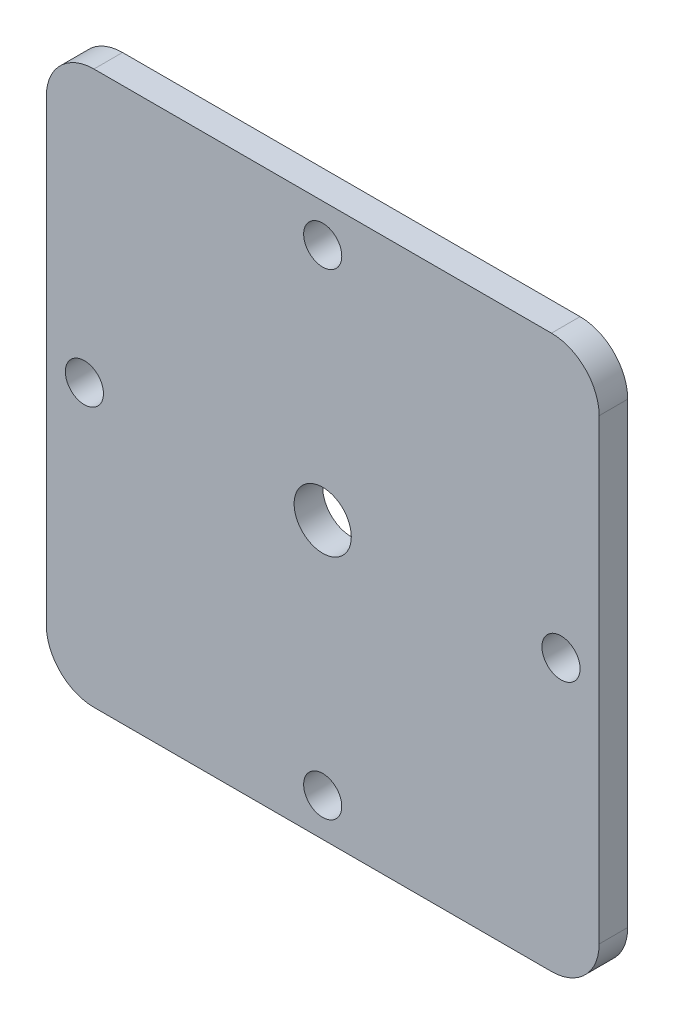
ISO-10303-21;
HEADER;
FILE_DESCRIPTION(('STEP AP214'),'2;1');
FILE_NAME('part.step','',(''),(''),'','','');
FILE_SCHEMA(('AUTOMOTIVE_DESIGN { 1 0 10303 214 1 1 1 1 }'));
ENDSEC;
DATA;
#1=APPLICATION_CONTEXT('core data for automotive mechanical design processes');
#2=APPLICATION_PROTOCOL_DEFINITION('international standard','automotive_design',2000,#1);
#3=PRODUCT_CONTEXT('',#1,'mechanical');
#4=PRODUCT('Part','Part','',(#3));
#5=PRODUCT_RELATED_PRODUCT_CATEGORY('part','',(#4));
#6=PRODUCT_DEFINITION_FORMATION('','',#4);
#7=PRODUCT_DEFINITION_CONTEXT('part definition',#1,'design');
#8=PRODUCT_DEFINITION('design','',#6,#7);
#9=PRODUCT_DEFINITION_SHAPE('','',#8);
#10=(LENGTH_UNIT() NAMED_UNIT(*) SI_UNIT(.MILLI.,.METRE.));
#11=(NAMED_UNIT(*) PLANE_ANGLE_UNIT() SI_UNIT($,.RADIAN.));
#12=(NAMED_UNIT(*) SI_UNIT($,.STERADIAN.) SOLID_ANGLE_UNIT());
#13=UNCERTAINTY_MEASURE_WITH_UNIT(LENGTH_MEASURE(1.E-05),#10,'distance_accuracy_value','');
#14=(GEOMETRIC_REPRESENTATION_CONTEXT(3) GLOBAL_UNCERTAINTY_ASSIGNED_CONTEXT((#13)) GLOBAL_UNIT_ASSIGNED_CONTEXT((#10,
#11,#12)) REPRESENTATION_CONTEXT('',''));
#15=CARTESIAN_POINT('',(0.,0.,0.));
#16=DIRECTION('',(0.,0.,1.));
#17=DIRECTION('',(1.,0.,0.));
#18=AXIS2_PLACEMENT_3D('',#15,#16,#17);
#19=CARTESIAN_POINT('',(24.,24.,3.));
#20=DIRECTION('',(0.,0.,1.));
#21=DIRECTION('',(1.,0.,0.));
#22=AXIS2_PLACEMENT_3D('',#19,#20,#21);
#23=CYLINDRICAL_SURFACE('',#22,5.);
#24=DIRECTION('',(0.,0.,1.));
#25=VECTOR('',#24,1.);
#26=CARTESIAN_POINT('',(29.,24.,3.));
#27=LINE('',#26,#25);
#28=CARTESIAN_POINT('',(29.,24.,0.));
#29=VERTEX_POINT('',#28);
#30=CARTESIAN_POINT('',(29.,24.,3.));
#31=VERTEX_POINT('',#30);
#32=EDGE_CURVE('E161',#29,#31,#27,.T.);
#33=ORIENTED_EDGE('',*,*,#32,.F.);
#34=CARTESIAN_POINT('',(24.,24.,0.));
#35=DIRECTION('',(0.,0.,-1.));
#36=DIRECTION('',(-1.,0.,0.));
#37=AXIS2_PLACEMENT_3D('',#34,#35,#36);
#38=CIRCLE('',#37,5.);
#39=CARTESIAN_POINT('',(24.,29.,0.));
#40=VERTEX_POINT('',#39);
#41=EDGE_CURVE('E44',#40,#29,#38,.T.);
#42=ORIENTED_EDGE('',*,*,#41,.F.);
#43=DIRECTION('',(0.,0.,1.));
#44=VECTOR('',#43,1.);
#45=CARTESIAN_POINT('',(24.,29.,3.));
#46=LINE('',#45,#44);
#47=CARTESIAN_POINT('',(24.,29.,3.));
#48=VERTEX_POINT('',#47);
#49=EDGE_CURVE('E163',#48,#40,#46,.F.);
#50=ORIENTED_EDGE('',*,*,#49,.F.);
#51=CARTESIAN_POINT('',(24.,24.,3.));
#52=DIRECTION('',(0.,0.,-1.));
#53=DIRECTION('',(-1.,0.,0.));
#54=AXIS2_PLACEMENT_3D('',#51,#52,#53);
#55=CIRCLE('',#54,5.);
#56=EDGE_CURVE('E11',#31,#48,#55,.F.);
#57=ORIENTED_EDGE('',*,*,#56,.F.);
#58=EDGE_LOOP('',(#33,#42,#50,#57));
#59=FACE_BOUND('',#58,.T.);
#60=ADVANCED_FACE('F37',(#59),#23,.T.);
#61=CARTESIAN_POINT('',(-24.,24.,3.));
#62=DIRECTION('',(0.,0.,1.));
#63=DIRECTION('',(1.,0.,0.));
#64=AXIS2_PLACEMENT_3D('',#61,#62,#63);
#65=CYLINDRICAL_SURFACE('',#64,5.);
#66=DIRECTION('',(0.,0.,1.));
#67=VECTOR('',#66,1.);
#68=CARTESIAN_POINT('',(-24.,29.,3.));
#69=LINE('',#68,#67);
#70=CARTESIAN_POINT('',(-24.,29.,0.));
#71=VERTEX_POINT('',#70);
#72=CARTESIAN_POINT('',(-24.,29.,3.));
#73=VERTEX_POINT('',#72);
#74=EDGE_CURVE('E150',#71,#73,#69,.T.);
#75=ORIENTED_EDGE('',*,*,#74,.F.);
#76=CARTESIAN_POINT('',(-24.,24.,0.));
#77=DIRECTION('',(0.,0.,-1.));
#78=DIRECTION('',(-1.,0.,0.));
#79=AXIS2_PLACEMENT_3D('',#76,#77,#78);
#80=CIRCLE('',#79,5.);
#81=CARTESIAN_POINT('',(-29.,24.,0.));
#82=VERTEX_POINT('',#81);
#83=EDGE_CURVE('E156',#82,#71,#80,.T.);
#84=ORIENTED_EDGE('',*,*,#83,.F.);
#85=DIRECTION('',(0.,0.,1.));
#86=VECTOR('',#85,1.);
#87=CARTESIAN_POINT('',(-29.,24.,3.));
#88=LINE('',#87,#86);
#89=CARTESIAN_POINT('',(-29.,24.,3.));
#90=VERTEX_POINT('',#89);
#91=EDGE_CURVE('E153',#90,#82,#88,.F.);
#92=ORIENTED_EDGE('',*,*,#91,.F.);
#93=CARTESIAN_POINT('',(-24.,24.,3.));
#94=DIRECTION('',(0.,0.,-1.));
#95=DIRECTION('',(-1.,0.,0.));
#96=AXIS2_PLACEMENT_3D('',#93,#94,#95);
#97=CIRCLE('',#96,5.);
#98=EDGE_CURVE('E159',#73,#90,#97,.F.);
#99=ORIENTED_EDGE('',*,*,#98,.F.);
#100=EDGE_LOOP('',(#75,#84,#92,#99));
#101=FACE_BOUND('',#100,.T.);
#102=ADVANCED_FACE('F173',(#101),#65,.T.);
#103=CARTESIAN_POINT('',(-24.,-24.,3.));
#104=DIRECTION('',(0.,0.,-1.));
#105=DIRECTION('',(-1.,0.,0.));
#106=AXIS2_PLACEMENT_3D('',#103,#104,#105);
#107=CYLINDRICAL_SURFACE('',#106,5.);
#108=DIRECTION('',(0.,0.,-1.));
#109=VECTOR('',#108,1.);
#110=CARTESIAN_POINT('',(-24.,-29.,3.));
#111=LINE('',#110,#109);
#112=CARTESIAN_POINT('',(-24.,-29.,3.));
#113=VERTEX_POINT('',#112);
#114=CARTESIAN_POINT('',(-24.,-29.,0.));
#115=VERTEX_POINT('',#114);
#116=EDGE_CURVE('E110',#113,#115,#111,.T.);
#117=ORIENTED_EDGE('',*,*,#116,.F.);
#118=CARTESIAN_POINT('',(-24.,-24.,3.));
#119=DIRECTION('',(0.,0.,-1.));
#120=DIRECTION('',(-1.,0.,0.));
#121=AXIS2_PLACEMENT_3D('',#118,#119,#120);
#122=CIRCLE('',#121,5.);
#123=CARTESIAN_POINT('',(-29.,-24.,3.));
#124=VERTEX_POINT('',#123);
#125=EDGE_CURVE('E145',#124,#113,#122,.F.);
#126=ORIENTED_EDGE('',*,*,#125,.F.);
#127=DIRECTION('',(0.,0.,-1.));
#128=VECTOR('',#127,1.);
#129=CARTESIAN_POINT('',(-29.,-24.,3.));
#130=LINE('',#129,#128);
#131=CARTESIAN_POINT('',(-29.,-24.,0.));
#132=VERTEX_POINT('',#131);
#133=EDGE_CURVE('E142',#132,#124,#130,.F.);
#134=ORIENTED_EDGE('',*,*,#133,.F.);
#135=CARTESIAN_POINT('',(-24.,-24.,0.));
#136=DIRECTION('',(0.,0.,-1.));
#137=DIRECTION('',(-1.,0.,0.));
#138=AXIS2_PLACEMENT_3D('',#135,#136,#137);
#139=CIRCLE('',#138,5.);
#140=EDGE_CURVE('E147',#115,#132,#139,.T.);
#141=ORIENTED_EDGE('',*,*,#140,.F.);
#142=EDGE_LOOP('',(#117,#126,#134,#141));
#143=FACE_BOUND('',#142,.T.);
#144=ADVANCED_FACE('F225',(#143),#107,.T.);
#145=CARTESIAN_POINT('',(24.,-24.,3.));
#146=DIRECTION('',(0.,0.,-1.));
#147=DIRECTION('',(-1.,0.,0.));
#148=AXIS2_PLACEMENT_3D('',#145,#146,#147);
#149=CYLINDRICAL_SURFACE('',#148,5.);
#150=DIRECTION('',(0.,0.,-1.));
#151=VECTOR('',#150,1.);
#152=CARTESIAN_POINT('',(29.,-24.,3.));
#153=LINE('',#152,#151);
#154=CARTESIAN_POINT('',(29.,-24.,3.));
#155=VERTEX_POINT('',#154);
#156=CARTESIAN_POINT('',(29.,-24.,0.));
#157=VERTEX_POINT('',#156);
#158=EDGE_CURVE('E103',#155,#157,#153,.T.);
#159=ORIENTED_EDGE('',*,*,#158,.F.);
#160=CARTESIAN_POINT('',(24.,-24.,3.));
#161=DIRECTION('',(0.,0.,-1.));
#162=DIRECTION('',(-1.,0.,0.));
#163=AXIS2_PLACEMENT_3D('',#160,#161,#162);
#164=CIRCLE('',#163,5.);
#165=CARTESIAN_POINT('',(24.,-29.,3.));
#166=VERTEX_POINT('',#165);
#167=EDGE_CURVE('E111',#166,#155,#164,.F.);
#168=ORIENTED_EDGE('',*,*,#167,.F.);
#169=DIRECTION('',(0.,0.,-1.));
#170=VECTOR('',#169,1.);
#171=CARTESIAN_POINT('',(24.,-29.,3.));
#172=LINE('',#171,#170);
#173=CARTESIAN_POINT('',(24.,-29.,0.));
#174=VERTEX_POINT('',#173);
#175=EDGE_CURVE('E106',#174,#166,#172,.F.);
#176=ORIENTED_EDGE('',*,*,#175,.F.);
#177=CARTESIAN_POINT('',(24.,-24.,0.));
#178=DIRECTION('',(0.,0.,-1.));
#179=DIRECTION('',(-1.,0.,0.));
#180=AXIS2_PLACEMENT_3D('',#177,#178,#179);
#181=CIRCLE('',#180,5.);
#182=EDGE_CURVE('E99',#157,#174,#181,.T.);
#183=ORIENTED_EDGE('',*,*,#182,.F.);
#184=EDGE_LOOP('',(#159,#168,#176,#183));
#185=FACE_BOUND('',#184,.T.);
#186=ADVANCED_FACE('F101',(#185),#149,.T.);
#187=CARTESIAN_POINT('',(0.,0.,3.));
#188=DIRECTION('',(0.,0.,-1.));
#189=DIRECTION('',(-1.,0.,0.));
#190=AXIS2_PLACEMENT_3D('',#187,#188,#189);
#191=PLANE('',#190);
#192=CARTESIAN_POINT('',(0.,0.,3.));
#193=DIRECTION('',(0.,0.,1.));
#194=DIRECTION('',(1.,0.,0.));
#195=AXIS2_PLACEMENT_3D('',#192,#193,#194);
#196=CIRCLE('',#195,3.);
#197=CARTESIAN_POINT('',(3.,0.,3.));
#198=VERTEX_POINT('',#197);
#199=EDGE_CURVE('E203',#198,#198,#196,.T.);
#200=ORIENTED_EDGE('',*,*,#199,.F.);
#201=EDGE_LOOP('',(#200));
#202=FACE_BOUND('',#201,.T.);
#203=DIRECTION('',(0.,1.,0.));
#204=VECTOR('',#203,1.);
#205=CARTESIAN_POINT('',(29.,-29.,3.));
#206=LINE('',#205,#204);
#207=EDGE_CURVE('E118',#155,#31,#206,.T.);
#208=ORIENTED_EDGE('',*,*,#207,.T.);
#209=ORIENTED_EDGE('',*,*,#56,.T.);
#210=DIRECTION('',(-1.,0.,0.));
#211=VECTOR('',#210,1.);
#212=CARTESIAN_POINT('',(-29.,29.,3.));
#213=LINE('',#212,#211);
#214=EDGE_CURVE('E167',#48,#73,#213,.T.);
#215=ORIENTED_EDGE('',*,*,#214,.T.);
#216=ORIENTED_EDGE('',*,*,#98,.T.);
#217=DIRECTION('',(0.,-1.,0.));
#218=VECTOR('',#217,1.);
#219=CARTESIAN_POINT('',(-29.,-29.,3.));
#220=LINE('',#219,#218);
#221=EDGE_CURVE('E177',#90,#124,#220,.T.);
#222=ORIENTED_EDGE('',*,*,#221,.T.);
#223=ORIENTED_EDGE('',*,*,#125,.T.);
#224=DIRECTION('',(1.,0.,0.));
#225=VECTOR('',#224,1.);
#226=CARTESIAN_POINT('',(-29.,-29.,3.));
#227=LINE('',#226,#225);
#228=EDGE_CURVE('E119',#113,#166,#227,.T.);
#229=ORIENTED_EDGE('',*,*,#228,.T.);
#230=ORIENTED_EDGE('',*,*,#167,.T.);
#231=EDGE_LOOP('',(#208,#209,#215,#216,#222,#223,#229,#230));
#232=FACE_BOUND('',#231,.T.);
#233=CARTESIAN_POINT('',(0.,25.,3.));
#234=DIRECTION('',(0.,0.,1.));
#235=DIRECTION('',(1.,0.,0.));
#236=AXIS2_PLACEMENT_3D('',#233,#234,#235);
#237=CIRCLE('',#236,2.);
#238=CARTESIAN_POINT('',(1.99999999999999,25.,3.));
#239=VERTEX_POINT('',#238);
#240=EDGE_CURVE('E125',#239,#239,#237,.T.);
#241=ORIENTED_EDGE('',*,*,#240,.F.);
#242=EDGE_LOOP('',(#241));
#243=FACE_BOUND('',#242,.T.);
#244=CARTESIAN_POINT('',(-25.,0.,3.));
#245=DIRECTION('',(0.,0.,1.));
#246=DIRECTION('',(-1.,0.,0.));
#247=AXIS2_PLACEMENT_3D('',#244,#245,#246);
#248=CIRCLE('',#247,2.);
#249=CARTESIAN_POINT('',(-27.,0.,3.));
#250=VERTEX_POINT('',#249);
#251=EDGE_CURVE('E183',#250,#250,#248,.T.);
#252=ORIENTED_EDGE('',*,*,#251,.F.);
#253=EDGE_LOOP('',(#252));
#254=FACE_BOUND('',#253,.T.);
#255=CARTESIAN_POINT('',(0.,-25.,3.));
#256=DIRECTION('',(0.,0.,1.));
#257=DIRECTION('',(-1.,0.,0.));
#258=AXIS2_PLACEMENT_3D('',#255,#256,#257);
#259=CIRCLE('',#258,2.);
#260=CARTESIAN_POINT('',(-2.00000000000001,-25.,3.));
#261=VERTEX_POINT('',#260);
#262=EDGE_CURVE('E188',#261,#261,#259,.T.);
#263=ORIENTED_EDGE('',*,*,#262,.F.);
#264=EDGE_LOOP('',(#263));
#265=FACE_BOUND('',#264,.T.);
#266=CARTESIAN_POINT('',(25.,0.,3.));
#267=DIRECTION('',(0.,0.,1.));
#268=DIRECTION('',(-1.,0.,0.));
#269=AXIS2_PLACEMENT_3D('',#266,#267,#268);
#270=CIRCLE('',#269,2.);
#271=CARTESIAN_POINT('',(23.,0.,3.));
#272=VERTEX_POINT('',#271);
#273=EDGE_CURVE('E194',#272,#272,#270,.T.);
#274=ORIENTED_EDGE('',*,*,#273,.F.);
#275=EDGE_LOOP('',(#274));
#276=FACE_BOUND('',#275,.T.);
#277=ADVANCED_FACE('F175',(#202,#232,#243,#254,#265,#276),#191,.F.);
#278=CARTESIAN_POINT('',(0.,0.,0.));
#279=DIRECTION('',(0.,0.,-1.));
#280=DIRECTION('',(-1.,0.,0.));
#281=AXIS2_PLACEMENT_3D('',#278,#279,#280);
#282=PLANE('',#281);
#283=CARTESIAN_POINT('',(0.,0.,0.));
#284=DIRECTION('',(0.,0.,1.));
#285=DIRECTION('',(1.,0.,0.));
#286=AXIS2_PLACEMENT_3D('',#283,#284,#285);
#287=CIRCLE('',#286,3.);
#288=CARTESIAN_POINT('',(3.,0.,0.));
#289=VERTEX_POINT('',#288);
#290=EDGE_CURVE('E200',#289,#289,#287,.T.);
#291=ORIENTED_EDGE('',*,*,#290,.T.);
#292=EDGE_LOOP('',(#291));
#293=FACE_BOUND('',#292,.T.);
#294=CARTESIAN_POINT('',(0.,-25.,0.));
#295=DIRECTION('',(0.,0.,1.));
#296=DIRECTION('',(-1.,0.,0.));
#297=AXIS2_PLACEMENT_3D('',#294,#295,#296);
#298=CIRCLE('',#297,2.);
#299=CARTESIAN_POINT('',(-2.00000000000001,-25.,0.));
#300=VERTEX_POINT('',#299);
#301=EDGE_CURVE('E191',#300,#300,#298,.T.);
#302=ORIENTED_EDGE('',*,*,#301,.T.);
#303=EDGE_LOOP('',(#302));
#304=FACE_BOUND('',#303,.T.);
#305=CARTESIAN_POINT('',(0.,25.,0.));
#306=DIRECTION('',(0.,0.,1.));
#307=DIRECTION('',(1.,0.,0.));
#308=AXIS2_PLACEMENT_3D('',#305,#306,#307);
#309=CIRCLE('',#308,2.);
#310=CARTESIAN_POINT('',(1.99999999999999,25.,0.));
#311=VERTEX_POINT('',#310);
#312=EDGE_CURVE('E130',#311,#311,#309,.T.);
#313=ORIENTED_EDGE('',*,*,#312,.T.);
#314=EDGE_LOOP('',(#313));
#315=FACE_BOUND('',#314,.T.);
#316=DIRECTION('',(-1.,0.,0.));
#317=VECTOR('',#316,1.);
#318=CARTESIAN_POINT('',(-29.,29.,0.));
#319=LINE('',#318,#317);
#320=EDGE_CURVE('E124',#40,#71,#319,.T.);
#321=ORIENTED_EDGE('',*,*,#320,.F.);
#322=ORIENTED_EDGE('',*,*,#41,.T.);
#323=DIRECTION('',(0.,1.,0.));
#324=VECTOR('',#323,1.);
#325=CARTESIAN_POINT('',(29.,-29.,0.));
#326=LINE('',#325,#324);
#327=EDGE_CURVE('E117',#157,#29,#326,.T.);
#328=ORIENTED_EDGE('',*,*,#327,.F.);
#329=ORIENTED_EDGE('',*,*,#182,.T.);
#330=DIRECTION('',(1.,0.,0.));
#331=VECTOR('',#330,1.);
#332=CARTESIAN_POINT('',(-29.,-29.,0.));
#333=LINE('',#332,#331);
#334=EDGE_CURVE('E136',#115,#174,#333,.T.);
#335=ORIENTED_EDGE('',*,*,#334,.F.);
#336=ORIENTED_EDGE('',*,*,#140,.T.);
#337=DIRECTION('',(0.,-1.,0.));
#338=VECTOR('',#337,1.);
#339=CARTESIAN_POINT('',(-29.,-29.,0.));
#340=LINE('',#339,#338);
#341=EDGE_CURVE('E127',#82,#132,#340,.T.);
#342=ORIENTED_EDGE('',*,*,#341,.F.);
#343=ORIENTED_EDGE('',*,*,#83,.T.);
#344=EDGE_LOOP('',(#321,#322,#328,#329,#335,#336,#342,#343));
#345=FACE_BOUND('',#344,.T.);
#346=CARTESIAN_POINT('',(-25.,0.,0.));
#347=DIRECTION('',(0.,0.,1.));
#348=DIRECTION('',(-1.,0.,0.));
#349=AXIS2_PLACEMENT_3D('',#346,#347,#348);
#350=CIRCLE('',#349,2.);
#351=CARTESIAN_POINT('',(-27.,0.,0.));
#352=VERTEX_POINT('',#351);
#353=EDGE_CURVE('E185',#352,#352,#350,.T.);
#354=ORIENTED_EDGE('',*,*,#353,.T.);
#355=EDGE_LOOP('',(#354));
#356=FACE_BOUND('',#355,.T.);
#357=CARTESIAN_POINT('',(25.,0.,0.));
#358=DIRECTION('',(0.,0.,1.));
#359=DIRECTION('',(-1.,0.,0.));
#360=AXIS2_PLACEMENT_3D('',#357,#358,#359);
#361=CIRCLE('',#360,2.);
#362=CARTESIAN_POINT('',(23.,0.,0.));
#363=VERTEX_POINT('',#362);
#364=EDGE_CURVE('E197',#363,#363,#361,.T.);
#365=ORIENTED_EDGE('',*,*,#364,.T.);
#366=EDGE_LOOP('',(#365));
#367=FACE_BOUND('',#366,.T.);
#368=ADVANCED_FACE('F122',(#293,#304,#315,#345,#356,#367),#282,.T.);
#369=CARTESIAN_POINT('',(29.,-29.,3.));
#370=DIRECTION('',(-1.,0.,0.));
#371=DIRECTION('',(0.,0.,1.));
#372=AXIS2_PLACEMENT_3D('',#369,#370,#371);
#373=PLANE('',#372);
#374=ORIENTED_EDGE('',*,*,#327,.T.);
#375=ORIENTED_EDGE('',*,*,#32,.T.);
#376=ORIENTED_EDGE('',*,*,#207,.F.);
#377=ORIENTED_EDGE('',*,*,#158,.T.);
#378=EDGE_LOOP('',(#374,#375,#376,#377));
#379=FACE_BOUND('',#378,.T.);
#380=ADVANCED_FACE('F115',(#379),#373,.F.);
#381=CARTESIAN_POINT('',(-29.,29.,3.));
#382=DIRECTION('',(0.,-1.,0.));
#383=DIRECTION('',(0.,0.,-1.));
#384=AXIS2_PLACEMENT_3D('',#381,#382,#383);
#385=PLANE('',#384);
#386=ORIENTED_EDGE('',*,*,#214,.F.);
#387=ORIENTED_EDGE('',*,*,#49,.T.);
#388=ORIENTED_EDGE('',*,*,#320,.T.);
#389=ORIENTED_EDGE('',*,*,#74,.T.);
#390=EDGE_LOOP('',(#386,#387,#388,#389));
#391=FACE_BOUND('',#390,.T.);
#392=ADVANCED_FACE('F166',(#391),#385,.F.);
#393=CARTESIAN_POINT('',(-29.,-29.,3.));
#394=DIRECTION('',(1.,0.,0.));
#395=DIRECTION('',(0.,0.,-1.));
#396=AXIS2_PLACEMENT_3D('',#393,#394,#395);
#397=PLANE('',#396);
#398=ORIENTED_EDGE('',*,*,#221,.F.);
#399=ORIENTED_EDGE('',*,*,#91,.T.);
#400=ORIENTED_EDGE('',*,*,#341,.T.);
#401=ORIENTED_EDGE('',*,*,#133,.T.);
#402=EDGE_LOOP('',(#398,#399,#400,#401));
#403=FACE_BOUND('',#402,.T.);
#404=ADVANCED_FACE('F239',(#403),#397,.F.);
#405=CARTESIAN_POINT('',(-29.,-29.,3.));
#406=DIRECTION('',(0.,1.,0.));
#407=DIRECTION('',(0.,0.,1.));
#408=AXIS2_PLACEMENT_3D('',#405,#406,#407);
#409=PLANE('',#408);
#410=ORIENTED_EDGE('',*,*,#228,.F.);
#411=ORIENTED_EDGE('',*,*,#116,.T.);
#412=ORIENTED_EDGE('',*,*,#334,.T.);
#413=ORIENTED_EDGE('',*,*,#175,.T.);
#414=EDGE_LOOP('',(#410,#411,#412,#413));
#415=FACE_BOUND('',#414,.T.);
#416=ADVANCED_FACE('F234',(#415),#409,.F.);
#417=CARTESIAN_POINT('',(0.,25.,3.));
#418=DIRECTION('',(0.,0.,-1.));
#419=DIRECTION('',(-1.,0.,0.));
#420=AXIS2_PLACEMENT_3D('',#417,#418,#419);
#421=CYLINDRICAL_SURFACE('',#420,2.);
#422=ORIENTED_EDGE('',*,*,#240,.T.);
#423=EDGE_LOOP('',(#422));
#424=FACE_BOUND('',#423,.T.);
#425=ORIENTED_EDGE('',*,*,#312,.F.);
#426=EDGE_LOOP('',(#425));
#427=FACE_BOUND('',#426,.T.);
#428=ADVANCED_FACE('F246',(#424,#427),#421,.F.);
#429=CARTESIAN_POINT('',(-25.,0.,3.));
#430=DIRECTION('',(0.,0.,-1.));
#431=DIRECTION('',(-1.,0.,0.));
#432=AXIS2_PLACEMENT_3D('',#429,#430,#431);
#433=CYLINDRICAL_SURFACE('',#432,2.);
#434=ORIENTED_EDGE('',*,*,#251,.T.);
#435=EDGE_LOOP('',(#434));
#436=FACE_BOUND('',#435,.T.);
#437=ORIENTED_EDGE('',*,*,#353,.F.);
#438=EDGE_LOOP('',(#437));
#439=FACE_BOUND('',#438,.T.);
#440=ADVANCED_FACE('F281',(#436,#439),#433,.F.);
#441=CARTESIAN_POINT('',(0.,-25.,3.));
#442=DIRECTION('',(0.,0.,-1.));
#443=DIRECTION('',(-1.,0.,0.));
#444=AXIS2_PLACEMENT_3D('',#441,#442,#443);
#445=CYLINDRICAL_SURFACE('',#444,2.);
#446=ORIENTED_EDGE('',*,*,#262,.T.);
#447=EDGE_LOOP('',(#446));
#448=FACE_BOUND('',#447,.T.);
#449=ORIENTED_EDGE('',*,*,#301,.F.);
#450=EDGE_LOOP('',(#449));
#451=FACE_BOUND('',#450,.T.);
#452=ADVANCED_FACE('F271',(#448,#451),#445,.F.);
#453=CARTESIAN_POINT('',(25.,0.,3.));
#454=DIRECTION('',(0.,0.,-1.));
#455=DIRECTION('',(-1.,0.,0.));
#456=AXIS2_PLACEMENT_3D('',#453,#454,#455);
#457=CYLINDRICAL_SURFACE('',#456,2.);
#458=ORIENTED_EDGE('',*,*,#273,.T.);
#459=EDGE_LOOP('',(#458));
#460=FACE_BOUND('',#459,.T.);
#461=ORIENTED_EDGE('',*,*,#364,.F.);
#462=EDGE_LOOP('',(#461));
#463=FACE_BOUND('',#462,.T.);
#464=ADVANCED_FACE('F214',(#460,#463),#457,.F.);
#465=CARTESIAN_POINT('',(0.,0.,0.));
#466=DIRECTION('',(0.,0.,1.));
#467=DIRECTION('',(1.,0.,0.));
#468=AXIS2_PLACEMENT_3D('',#465,#466,#467);
#469=CYLINDRICAL_SURFACE('',#468,3.);
#470=ORIENTED_EDGE('',*,*,#290,.F.);
#471=EDGE_LOOP('',(#470));
#472=FACE_BOUND('',#471,.T.);
#473=ORIENTED_EDGE('',*,*,#199,.T.);
#474=EDGE_LOOP('',(#473));
#475=FACE_BOUND('',#474,.T.);
#476=ADVANCED_FACE('F211',(#472,#475),#469,.F.);
#477=CLOSED_SHELL('',(#60,#102,#144,#186,#277,#368,#380,#392,#404,#416,#428,#440,#452,#464,#476));
#478=MANIFOLD_SOLID_BREP('B2',#477);
#479=ADVANCED_BREP_SHAPE_REPRESENTATION('',(#18,#478),#14);
#480=SHAPE_DEFINITION_REPRESENTATION(#9,#479);
ENDSEC;
END-ISO-10303-21;
